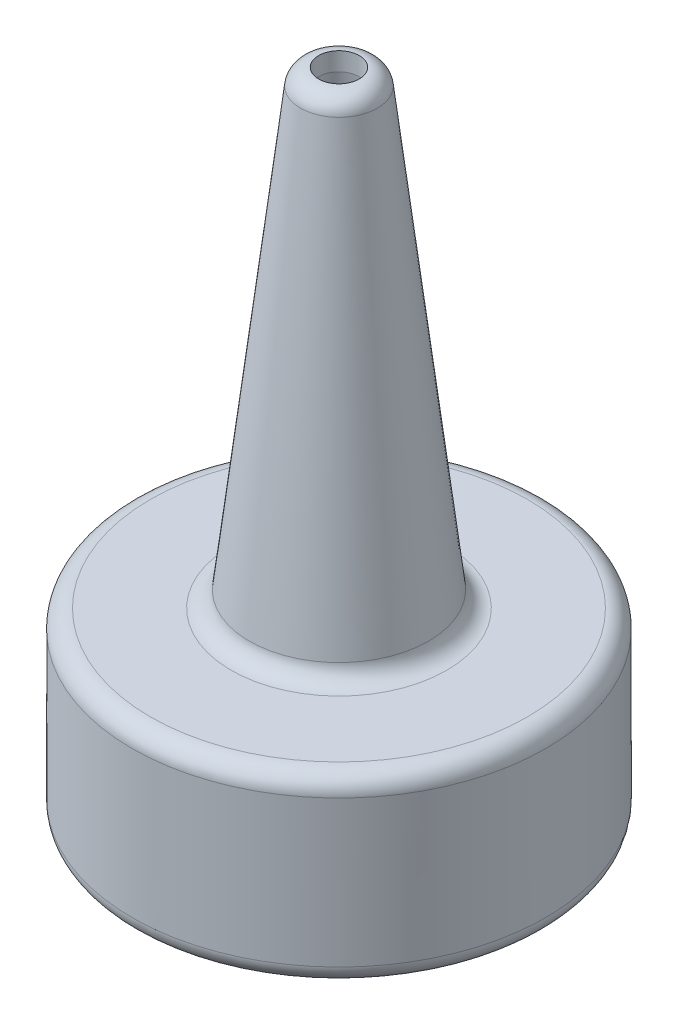
ISO-10303-21;
HEADER;
FILE_DESCRIPTION(('STEP AP214'),'2;1');
FILE_NAME('part.step','',(''),(''),'','','');
FILE_SCHEMA(('AUTOMOTIVE_DESIGN { 1 0 10303 214 1 1 1 1 }'));
ENDSEC;
DATA;
#1=APPLICATION_CONTEXT('core data for automotive mechanical design processes');
#2=APPLICATION_PROTOCOL_DEFINITION('international standard','automotive_design',2000,#1);
#3=PRODUCT_CONTEXT('',#1,'mechanical');
#4=PRODUCT('Part','Part','',(#3));
#5=PRODUCT_RELATED_PRODUCT_CATEGORY('part','',(#4));
#6=PRODUCT_DEFINITION_FORMATION('','',#4);
#7=PRODUCT_DEFINITION_CONTEXT('part definition',#1,'design');
#8=PRODUCT_DEFINITION('design','',#6,#7);
#9=PRODUCT_DEFINITION_SHAPE('','',#8);
#10=(LENGTH_UNIT() NAMED_UNIT(*) SI_UNIT(.MILLI.,.METRE.));
#11=(NAMED_UNIT(*) PLANE_ANGLE_UNIT() SI_UNIT($,.RADIAN.));
#12=(NAMED_UNIT(*) SI_UNIT($,.STERADIAN.) SOLID_ANGLE_UNIT());
#13=UNCERTAINTY_MEASURE_WITH_UNIT(LENGTH_MEASURE(1.E-05),#10,'distance_accuracy_value','');
#14=(GEOMETRIC_REPRESENTATION_CONTEXT(3) GLOBAL_UNCERTAINTY_ASSIGNED_CONTEXT((#13)) GLOBAL_UNIT_ASSIGNED_CONTEXT((#10,
#11,#12)) REPRESENTATION_CONTEXT('',''));
#15=CARTESIAN_POINT('',(0.,0.,0.));
#16=DIRECTION('',(0.,0.,1.));
#17=DIRECTION('',(1.,0.,0.));
#18=AXIS2_PLACEMENT_3D('',#15,#16,#17);
#19=CARTESIAN_POINT('',(0.,43.942,0.));
#20=DIRECTION('',(0.,1.,0.));
#21=DIRECTION('',(-1.,0.,0.));
#22=AXIS2_PLACEMENT_3D('',#19,#20,#21);
#23=CYLINDRICAL_SURFACE('',#22,14.351);
#24=CARTESIAN_POINT('',(0.,1.27,0.));
#25=DIRECTION('',(0.,1.,0.));
#26=DIRECTION('',(-1.,0.,0.));
#27=AXIS2_PLACEMENT_3D('',#24,#25,#26);
#28=CIRCLE('',#27,14.351);
#29=CARTESIAN_POINT('',(-14.351,1.27,0.));
#30=VERTEX_POINT('',#29);
#31=EDGE_CURVE('E45',#30,#30,#28,.T.);
#32=ORIENTED_EDGE('',*,*,#31,.T.);
#33=EDGE_LOOP('',(#32));
#34=FACE_BOUND('',#33,.T.);
#35=CARTESIAN_POINT('',(0.,11.43,0.));
#36=DIRECTION('',(0.,-1.,0.));
#37=DIRECTION('',(1.,0.,0.));
#38=AXIS2_PLACEMENT_3D('',#35,#36,#37);
#39=CIRCLE('',#38,14.351);
#40=CARTESIAN_POINT('',(14.351,11.43,0.));
#41=VERTEX_POINT('',#40);
#42=EDGE_CURVE('E49',#41,#41,#39,.T.);
#43=ORIENTED_EDGE('',*,*,#42,.T.);
#44=EDGE_LOOP('',(#43));
#45=FACE_BOUND('',#44,.T.);
#46=ADVANCED_FACE('F34',(#34,#45),#23,.T.);
#47=CARTESIAN_POINT('',(14.351,12.7,0.));
#48=DIRECTION('',(0.,-1.,0.));
#49=DIRECTION('',(1.,0.,0.));
#50=AXIS2_PLACEMENT_3D('',#47,#48,#49);
#51=PLANE('',#50);
#52=CARTESIAN_POINT('',(0.,12.7,0.));
#53=DIRECTION('',(0.,-1.,0.));
#54=DIRECTION('',(1.,0.,0.));
#55=AXIS2_PLACEMENT_3D('',#52,#53,#54);
#56=CIRCLE('',#55,7.47986253766671);
#57=CARTESIAN_POINT('',(7.47986253766671,12.7,0.));
#58=VERTEX_POINT('',#57);
#59=EDGE_CURVE('E10',#58,#58,#56,.T.);
#60=ORIENTED_EDGE('',*,*,#59,.T.);
#61=EDGE_LOOP('',(#60));
#62=FACE_BOUND('',#61,.T.);
#63=CARTESIAN_POINT('',(0.,12.7,0.));
#64=DIRECTION('',(0.,-1.,0.));
#65=DIRECTION('',(1.,0.,0.));
#66=AXIS2_PLACEMENT_3D('',#63,#64,#65);
#67=CIRCLE('',#66,13.081);
#68=CARTESIAN_POINT('',(13.081,12.7,0.));
#69=VERTEX_POINT('',#68);
#70=EDGE_CURVE('E41',#69,#69,#67,.F.);
#71=ORIENTED_EDGE('',*,*,#70,.T.);
#72=EDGE_LOOP('',(#71));
#73=FACE_BOUND('',#72,.T.);
#74=ADVANCED_FACE('F117',(#62,#73),#51,.F.);
#75=CARTESIAN_POINT('',(0.,12.7,0.));
#76=DIRECTION('',(0.,-1.,0.));
#77=DIRECTION('',(1.,0.,0.));
#78=AXIS2_PLACEMENT_3D('',#75,#76,#77);
#79=CONICAL_SURFACE('',#78,6.35,0.116655435441069);
#80=CARTESIAN_POINT('',(0.,44.0898166098091,0.));
#81=DIRECTION('',(0.,1.,0.));
#82=DIRECTION('',(-1.,0.,0.));
#83=AXIS2_PLACEMENT_3D('',#80,#81,#82);
#84=CIRCLE('',#83,2.67150586603799);
#85=CARTESIAN_POINT('',(-2.67150586603799,44.0898166098091,0.));
#86=VERTEX_POINT('',#85);
#87=EDGE_CURVE('E54',#86,#86,#84,.F.);
#88=ORIENTED_EDGE('',*,*,#87,.T.);
#89=EDGE_LOOP('',(#88));
#90=FACE_BOUND('',#89,.T.);
#91=CARTESIAN_POINT('',(0.,13.8221833901909,0.));
#92=DIRECTION('',(0.,-1.,0.));
#93=DIRECTION('',(1.,0.,0.));
#94=AXIS2_PLACEMENT_3D('',#91,#92,#93);
#95=CIRCLE('',#94,6.21849413396201);
#96=CARTESIAN_POINT('',(6.21849413396201,13.8221833901909,0.));
#97=VERTEX_POINT('',#96);
#98=EDGE_CURVE('E57',#97,#97,#95,.F.);
#99=ORIENTED_EDGE('',*,*,#98,.T.);
#100=EDGE_LOOP('',(#99));
#101=FACE_BOUND('',#100,.T.);
#102=ADVANCED_FACE('F101',(#90,#101),#79,.T.);
#103=CARTESIAN_POINT('',(0.,43.942,0.));
#104=DIRECTION('',(0.,1.,0.));
#105=DIRECTION('',(-1.,0.,0.));
#106=AXIS2_PLACEMENT_3D('',#103,#104,#105);
#107=CYLINDRICAL_SURFACE('',#106,1.4101374623333);
#108=CARTESIAN_POINT('',(0.,43.942,0.));
#109=DIRECTION('',(0.,1.,0.));
#110=DIRECTION('',(-1.,0.,0.));
#111=AXIS2_PLACEMENT_3D('',#108,#109,#110);
#112=CIRCLE('',#111,1.4101374623333);
#113=CARTESIAN_POINT('',(1.4101374623333,43.942,0.));
#114=VERTEX_POINT('',#113);
#115=EDGE_CURVE('E63',#114,#114,#112,.T.);
#116=ORIENTED_EDGE('',*,*,#115,.F.);
#117=EDGE_LOOP('',(#116));
#118=FACE_BOUND('',#117,.T.);
#119=CARTESIAN_POINT('',(0.,45.212,0.));
#120=DIRECTION('',(0.,1.,0.));
#121=DIRECTION('',(-1.,0.,0.));
#122=AXIS2_PLACEMENT_3D('',#119,#120,#121);
#123=CIRCLE('',#122,1.4101374623333);
#124=CARTESIAN_POINT('',(-1.41013746233329,45.212,0.));
#125=VERTEX_POINT('',#124);
#126=EDGE_CURVE('E60',#125,#125,#123,.T.);
#127=ORIENTED_EDGE('',*,*,#126,.T.);
#128=EDGE_LOOP('',(#127));
#129=FACE_BOUND('',#128,.T.);
#130=ADVANCED_FACE('F95',(#118,#129),#107,.F.);
#131=CARTESIAN_POINT('',(0.,43.942,0.));
#132=DIRECTION('',(0.,-1.,0.));
#133=DIRECTION('',(1.,0.,0.));
#134=AXIS2_PLACEMENT_3D('',#131,#132,#133);
#135=CONICAL_SURFACE('',#134,1.4101374623333,0.11665543544107);
#136=CARTESIAN_POINT('',(0.,11.43,0.));
#137=DIRECTION('',(0.,1.,0.));
#138=DIRECTION('',(-1.,0.,0.));
#139=AXIS2_PLACEMENT_3D('',#136,#137,#138);
#140=CIRCLE('',#139,5.2201374623333);
#141=CARTESIAN_POINT('',(5.2201374623333,11.43,0.));
#142=VERTEX_POINT('',#141);
#143=EDGE_CURVE('E66',#142,#142,#140,.T.);
#144=CARTESIAN_POINT('',(5.2201374623333,11.43,0.));
#145=CARTESIAN_POINT('',(5.1804499623333,11.7686666666667,0.));
#146=CARTESIAN_POINT('',(5.1407624623333,12.1073333333333,0.));
#147=CARTESIAN_POINT('',(5.0613874623333,12.7846666666667,0.));
#148=CARTESIAN_POINT('',(5.0216999623333,13.1233333333333,0.));
#149=CARTESIAN_POINT('',(4.9423249623333,13.8006666666667,0.));
#150=CARTESIAN_POINT('',(4.9026374623333,14.1393333333333,0.));
#151=CARTESIAN_POINT('',(4.8232624623333,14.8166666666667,0.));
#152=CARTESIAN_POINT('',(4.7835749623333,15.1553333333333,0.));
#153=CARTESIAN_POINT('',(4.7041999623333,15.8326666666667,0.));
#154=CARTESIAN_POINT('',(4.6645124623333,16.1713333333333,0.));
#155=CARTESIAN_POINT('',(4.5851374623333,16.8486666666667,0.));
#156=CARTESIAN_POINT('',(4.5454499623333,17.1873333333333,0.));
#157=CARTESIAN_POINT('',(4.4660749623333,17.8646666666667,0.));
#158=CARTESIAN_POINT('',(4.4263874623333,18.2033333333333,0.));
#159=CARTESIAN_POINT('',(4.3470124623333,18.8806666666667,0.));
#160=CARTESIAN_POINT('',(4.3073249623333,19.2193333333333,0.));
#161=CARTESIAN_POINT('',(4.2279499623333,19.8966666666667,0.));
#162=CARTESIAN_POINT('',(4.1882624623333,20.2353333333333,0.));
#163=CARTESIAN_POINT('',(4.1088874623333,20.9126666666667,0.));
#164=CARTESIAN_POINT('',(4.0691999623333,21.2513333333333,0.));
#165=CARTESIAN_POINT('',(3.9898249623333,21.9286666666667,0.));
#166=CARTESIAN_POINT('',(3.9501374623333,22.2673333333333,0.));
#167=CARTESIAN_POINT('',(3.8707624623333,22.9446666666667,0.));
#168=CARTESIAN_POINT('',(3.8310749623333,23.2833333333333,0.));
#169=CARTESIAN_POINT('',(3.7516999623333,23.9606666666667,0.));
#170=CARTESIAN_POINT('',(3.7120124623333,24.2993333333333,0.));
#171=CARTESIAN_POINT('',(3.6326374623333,24.9766666666667,0.));
#172=CARTESIAN_POINT('',(3.5929499623333,25.3153333333333,0.));
#173=CARTESIAN_POINT('',(3.5135749623333,25.9926666666667,0.));
#174=CARTESIAN_POINT('',(3.4738874623333,26.3313333333333,0.));
#175=CARTESIAN_POINT('',(3.3945124623333,27.0086666666667,0.));
#176=CARTESIAN_POINT('',(3.3548249623333,27.3473333333333,0.));
#177=CARTESIAN_POINT('',(3.2754499623333,28.0246666666667,0.));
#178=CARTESIAN_POINT('',(3.2357624623333,28.3633333333333,0.));
#179=CARTESIAN_POINT('',(3.1563874623333,29.0406666666667,0.));
#180=CARTESIAN_POINT('',(3.1166999623333,29.3793333333333,0.));
#181=CARTESIAN_POINT('',(3.0373249623333,30.0566666666667,0.));
#182=CARTESIAN_POINT('',(2.9976374623333,30.3953333333333,0.));
#183=CARTESIAN_POINT('',(2.9182624623333,31.0726666666667,0.));
#184=CARTESIAN_POINT('',(2.8785749623333,31.4113333333333,0.));
#185=CARTESIAN_POINT('',(2.7991999623333,32.0886666666667,0.));
#186=CARTESIAN_POINT('',(2.7595124623333,32.4273333333333,0.));
#187=CARTESIAN_POINT('',(2.6801374623333,33.1046666666667,0.));
#188=CARTESIAN_POINT('',(2.6404499623333,33.4433333333333,0.));
#189=CARTESIAN_POINT('',(2.5610749623333,34.1206666666667,0.));
#190=CARTESIAN_POINT('',(2.5213874623333,34.4593333333333,0.));
#191=CARTESIAN_POINT('',(2.4420124623333,35.1366666666667,0.));
#192=CARTESIAN_POINT('',(2.4023249623333,35.4753333333333,0.));
#193=CARTESIAN_POINT('',(2.3229499623333,36.1526666666667,0.));
#194=CARTESIAN_POINT('',(2.2832624623333,36.4913333333333,0.));
#195=CARTESIAN_POINT('',(2.2038874623333,37.1686666666667,0.));
#196=CARTESIAN_POINT('',(2.1641999623333,37.5073333333333,0.));
#197=CARTESIAN_POINT('',(2.0848249623333,38.1846666666667,0.));
#198=CARTESIAN_POINT('',(2.0451374623333,38.5233333333333,0.));
#199=CARTESIAN_POINT('',(1.9657624623333,39.2006666666667,0.));
#200=CARTESIAN_POINT('',(1.9260749623333,39.5393333333333,0.));
#201=CARTESIAN_POINT('',(1.8466999623333,40.2166666666667,0.));
#202=CARTESIAN_POINT('',(1.8070124623333,40.5553333333333,0.));
#203=CARTESIAN_POINT('',(1.7276374623333,41.2326666666667,0.));
#204=CARTESIAN_POINT('',(1.6879499623333,41.5713333333333,0.));
#205=CARTESIAN_POINT('',(1.6085749623333,42.2486666666667,0.));
#206=CARTESIAN_POINT('',(1.5688874623333,42.5873333333333,0.));
#207=CARTESIAN_POINT('',(1.4895124623333,43.2646666666667,0.));
#208=CARTESIAN_POINT('',(1.4498249623333,43.6033333333333,0.));
#209=CARTESIAN_POINT('',(1.4101374623333,43.942,0.));
#210=B_SPLINE_CURVE_WITH_KNOTS('',3,(#144,#145,#146,#147,#148,#149,#150,#151,#152,#153,#154,
#155,#156,#157,#158,#159,#160,#161,#162,#163,#164,#165,#166,#167,#168,#169,#170,#171,#172,#173,
#174,#175,#176,#177,#178,#179,#180,#181,#182,#183,#184,#185,#186,#187,#188,#189,#190,#191,#192,
#193,#194,#195,#196,#197,#198,#199,#200,#201,#202,#203,#204,#205,#206,#207,#208,#209),
.UNSPECIFIED.,.F.,.F.,(4,2,2,2,2,2,2,2,2,2,2,2,2,2,2,2,2,2,2,2,2,2,2,2,2,2,2,2,2,2,2,2,4),(0.,
1.02295253013337,2.04590506026673,3.06885759040009,4.09181012053345,5.11476265066682,
6.13771518080018,7.16066771093355,8.18362024106691,9.20657277120027,10.2295253013336,
11.252477831467,12.2754303616004,13.2983828917337,14.3213354218671,15.3442879520005,
16.3672404821338,17.3901930122672,18.4131455424005,19.4360980725339,20.4590506026673,
21.4820031328006,22.504955662934,23.5279081930674,24.5508607232007,25.5738132533341,
26.5967657834674,27.6197183136008,28.6426708437342,29.6656233738675,30.6885759040009,
31.7115284341343,32.7344809642676),.UNSPECIFIED.);
#211=EDGE_CURVE('BSEAM89',#142,#114,#210,.T.);
#212=ORIENTED_EDGE('',*,*,#143,.F.);
#213=ORIENTED_EDGE('',*,*,#115,.T.);
#214=ORIENTED_EDGE('',*,*,#211,.T.);
#215=ORIENTED_EDGE('',*,*,#211,.F.);
#216=EDGE_LOOP('',(#212,#214,#213,#215));
#217=FACE_BOUND('',#216,.T.);
#218=ADVANCED_FACE('F89',(#217),#135,.F.);
#219=CARTESIAN_POINT('',(13.081,11.43,0.));
#220=DIRECTION('',(0.,1.,0.));
#221=DIRECTION('',(-1.,0.,0.));
#222=AXIS2_PLACEMENT_3D('',#219,#220,#221);
#223=PLANE('',#222);
#224=CARTESIAN_POINT('',(0.,11.43,0.));
#225=DIRECTION('',(0.,1.,0.));
#226=DIRECTION('',(-1.,0.,0.));
#227=AXIS2_PLACEMENT_3D('',#224,#225,#226);
#228=CIRCLE('',#227,13.081);
#229=CARTESIAN_POINT('',(-13.081,11.43,0.));
#230=VERTEX_POINT('',#229);
#231=EDGE_CURVE('E69',#230,#230,#228,.T.);
#232=ORIENTED_EDGE('',*,*,#231,.F.);
#233=EDGE_LOOP('',(#232));
#234=FACE_BOUND('',#233,.T.);
#235=ORIENTED_EDGE('',*,*,#143,.T.);
#236=EDGE_LOOP('',(#235));
#237=FACE_BOUND('',#236,.T.);
#238=ADVANCED_FACE('F83',(#234,#237),#223,.F.);
#239=CARTESIAN_POINT('',(0.,43.942,0.));
#240=DIRECTION('',(0.,1.,0.));
#241=DIRECTION('',(-1.,0.,0.));
#242=AXIS2_PLACEMENT_3D('',#239,#240,#241);
#243=CYLINDRICAL_SURFACE('',#242,13.081);
#244=CARTESIAN_POINT('',(0.,0.,0.));
#245=DIRECTION('',(0.,1.,0.));
#246=DIRECTION('',(-1.,0.,0.));
#247=AXIS2_PLACEMENT_3D('',#244,#245,#246);
#248=CIRCLE('',#247,13.081);
#249=CARTESIAN_POINT('',(-13.081,0.,0.));
#250=VERTEX_POINT('',#249);
#251=EDGE_CURVE('E72',#250,#250,#248,.T.);
#252=ORIENTED_EDGE('',*,*,#251,.F.);
#253=EDGE_LOOP('',(#252));
#254=FACE_BOUND('',#253,.T.);
#255=ORIENTED_EDGE('',*,*,#231,.T.);
#256=EDGE_LOOP('',(#255));
#257=FACE_BOUND('',#256,.T.);
#258=ADVANCED_FACE('F79',(#254,#257),#243,.F.);
#259=CARTESIAN_POINT('',(0.,43.942,0.));
#260=DIRECTION('',(0.,-1.,0.));
#261=DIRECTION('',(1.,0.,0.));
#262=AXIS2_PLACEMENT_3D('',#259,#260,#261);
#263=TOROIDAL_SURFACE('',#262,1.4101374623333,1.27);
#264=ORIENTED_EDGE('',*,*,#87,.F.);
#265=EDGE_LOOP('',(#264));
#266=FACE_BOUND('',#265,.T.);
#267=ORIENTED_EDGE('',*,*,#126,.F.);
#268=EDGE_LOOP('',(#267));
#269=FACE_BOUND('',#268,.T.);
#270=ADVANCED_FACE('F82',(#266,#269),#263,.T.);
#271=CARTESIAN_POINT('',(0.,1.27,0.));
#272=DIRECTION('',(0.,1.,0.));
#273=DIRECTION('',(-1.,0.,0.));
#274=AXIS2_PLACEMENT_3D('',#271,#272,#273);
#275=TOROIDAL_SURFACE('',#274,13.081,1.27);
#276=ORIENTED_EDGE('',*,*,#251,.T.);
#277=EDGE_LOOP('',(#276));
#278=FACE_BOUND('',#277,.T.);
#279=ORIENTED_EDGE('',*,*,#31,.F.);
#280=EDGE_LOOP('',(#279));
#281=FACE_BOUND('',#280,.T.);
#282=ADVANCED_FACE('F76',(#278,#281),#275,.T.);
#283=CARTESIAN_POINT('',(0.,13.97,0.));
#284=DIRECTION('',(0.,-1.,0.));
#285=DIRECTION('',(1.,0.,0.));
#286=AXIS2_PLACEMENT_3D('',#283,#284,#285);
#287=TOROIDAL_SURFACE('',#286,7.47986253766671,1.27);
#288=ORIENTED_EDGE('',*,*,#59,.F.);
#289=EDGE_LOOP('',(#288));
#290=FACE_BOUND('',#289,.T.);
#291=ORIENTED_EDGE('',*,*,#98,.F.);
#292=EDGE_LOOP('',(#291));
#293=FACE_BOUND('',#292,.T.);
#294=ADVANCED_FACE('F112',(#290,#293),#287,.F.);
#295=CARTESIAN_POINT('',(0.,11.43,0.));
#296=DIRECTION('',(0.,-1.,0.));
#297=DIRECTION('',(1.,0.,0.));
#298=AXIS2_PLACEMENT_3D('',#295,#296,#297);
#299=TOROIDAL_SURFACE('',#298,13.081,1.27);
#300=ORIENTED_EDGE('',*,*,#42,.F.);
#301=EDGE_LOOP('',(#300));
#302=FACE_BOUND('',#301,.T.);
#303=ORIENTED_EDGE('',*,*,#70,.F.);
#304=EDGE_LOOP('',(#303));
#305=FACE_BOUND('',#304,.T.);
#306=ADVANCED_FACE('F36',(#302,#305),#299,.T.);
#307=CLOSED_SHELL('',(#46,#74,#102,#130,#218,#238,#258,#270,#282,#294,#306));
#308=MANIFOLD_SOLID_BREP('B2',#307);
#309=ADVANCED_BREP_SHAPE_REPRESENTATION('',(#18,#308),#14);
#310=SHAPE_DEFINITION_REPRESENTATION(#9,#309);
ENDSEC;
END-ISO-10303-21;
